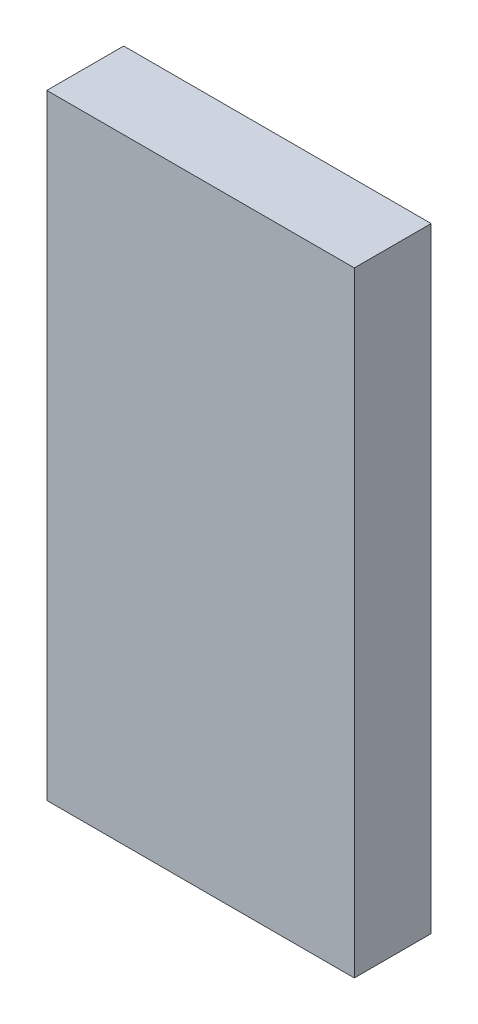
ISO-10303-21;
HEADER;
FILE_DESCRIPTION(('STEP AP214'),'2;1');
FILE_NAME('part.step','',(''),(''),'','','');
FILE_SCHEMA(('AUTOMOTIVE_DESIGN { 1 0 10303 214 1 1 1 1 }'));
ENDSEC;
DATA;
#1=APPLICATION_CONTEXT('core data for automotive mechanical design processes');
#2=APPLICATION_PROTOCOL_DEFINITION('international standard','automotive_design',2000,#1);
#3=PRODUCT_CONTEXT('',#1,'mechanical');
#4=PRODUCT('Part','Part','',(#3));
#5=PRODUCT_RELATED_PRODUCT_CATEGORY('part','',(#4));
#6=PRODUCT_DEFINITION_FORMATION('','',#4);
#7=PRODUCT_DEFINITION_CONTEXT('part definition',#1,'design');
#8=PRODUCT_DEFINITION('design','',#6,#7);
#9=PRODUCT_DEFINITION_SHAPE('','',#8);
#10=(LENGTH_UNIT() NAMED_UNIT(*) SI_UNIT(.MILLI.,.METRE.));
#11=(NAMED_UNIT(*) PLANE_ANGLE_UNIT() SI_UNIT($,.RADIAN.));
#12=(NAMED_UNIT(*) SI_UNIT($,.STERADIAN.) SOLID_ANGLE_UNIT());
#13=UNCERTAINTY_MEASURE_WITH_UNIT(LENGTH_MEASURE(1.E-05),#10,'distance_accuracy_value','');
#14=(GEOMETRIC_REPRESENTATION_CONTEXT(3) GLOBAL_UNCERTAINTY_ASSIGNED_CONTEXT((#13)) GLOBAL_UNIT_ASSIGNED_CONTEXT((#10,
#11,#12)) REPRESENTATION_CONTEXT('',''));
#15=CARTESIAN_POINT('',(0.,0.,0.));
#16=DIRECTION('',(0.,0.,1.));
#17=DIRECTION('',(1.,0.,0.));
#18=AXIS2_PLACEMENT_3D('',#15,#16,#17);
#19=CARTESIAN_POINT('',(-12.7,25.4,3.175));
#20=DIRECTION('',(1.,0.,0.));
#21=DIRECTION('',(0.,1.,0.));
#22=AXIS2_PLACEMENT_3D('',#19,#20,#21);
#23=PLANE('',#22);
#24=DIRECTION('',(0.,-1.,0.));
#25=VECTOR('',#24,1.);
#26=CARTESIAN_POINT('',(-12.7,25.4,-3.175));
#27=LINE('',#26,#25);
#28=CARTESIAN_POINT('',(-12.7,25.4,-3.175));
#29=VERTEX_POINT('',#28);
#30=CARTESIAN_POINT('',(-12.7,-25.4,-3.175));
#31=VERTEX_POINT('',#30);
#32=EDGE_CURVE('E106',#29,#31,#27,.T.);
#33=ORIENTED_EDGE('',*,*,#32,.T.);
#34=DIRECTION('',(0.,0.,-1.));
#35=VECTOR('',#34,1.);
#36=CARTESIAN_POINT('',(-12.7,-25.4,3.175));
#37=LINE('',#36,#35);
#38=CARTESIAN_POINT('',(-12.7,-25.4,3.175));
#39=VERTEX_POINT('',#38);
#40=EDGE_CURVE('E11',#39,#31,#37,.T.);
#41=ORIENTED_EDGE('',*,*,#40,.F.);
#42=DIRECTION('',(0.,-1.,0.));
#43=VECTOR('',#42,1.);
#44=CARTESIAN_POINT('',(-12.7,25.4,3.175));
#45=LINE('',#44,#43);
#46=CARTESIAN_POINT('',(-12.7,25.4,3.175));
#47=VERTEX_POINT('',#46);
#48=EDGE_CURVE('E88',#47,#39,#45,.T.);
#49=ORIENTED_EDGE('',*,*,#48,.F.);
#50=DIRECTION('',(0.,0.,-1.));
#51=VECTOR('',#50,1.);
#52=CARTESIAN_POINT('',(-12.7,25.4,3.175));
#53=LINE('',#52,#51);
#54=EDGE_CURVE('E102',#47,#29,#53,.T.);
#55=ORIENTED_EDGE('',*,*,#54,.T.);
#56=EDGE_LOOP('',(#33,#41,#49,#55));
#57=FACE_BOUND('',#56,.T.);
#58=ADVANCED_FACE('F36',(#57),#23,.F.);
#59=CARTESIAN_POINT('',(-12.7,-25.4,3.175));
#60=DIRECTION('',(0.,1.,0.));
#61=DIRECTION('',(0.,0.,1.));
#62=AXIS2_PLACEMENT_3D('',#59,#60,#61);
#63=PLANE('',#62);
#64=DIRECTION('',(1.,0.,0.));
#65=VECTOR('',#64,1.);
#66=CARTESIAN_POINT('',(-12.7,-25.4,-3.175));
#67=LINE('',#66,#65);
#68=CARTESIAN_POINT('',(12.7,-25.4,-3.175));
#69=VERTEX_POINT('',#68);
#70=EDGE_CURVE('E93',#31,#69,#67,.T.);
#71=ORIENTED_EDGE('',*,*,#70,.T.);
#72=DIRECTION('',(0.,0.,-1.));
#73=VECTOR('',#72,1.);
#74=CARTESIAN_POINT('',(12.7,-25.4,3.175));
#75=LINE('',#74,#73);
#76=CARTESIAN_POINT('',(12.7,-25.4,3.175));
#77=VERTEX_POINT('',#76);
#78=EDGE_CURVE('E45',#77,#69,#75,.T.);
#79=ORIENTED_EDGE('',*,*,#78,.F.);
#80=DIRECTION('',(1.,0.,0.));
#81=VECTOR('',#80,1.);
#82=CARTESIAN_POINT('',(-12.7,-25.4,3.175));
#83=LINE('',#82,#81);
#84=EDGE_CURVE('E83',#39,#77,#83,.T.);
#85=ORIENTED_EDGE('',*,*,#84,.F.);
#86=ORIENTED_EDGE('',*,*,#40,.T.);
#87=EDGE_LOOP('',(#71,#79,#85,#86));
#88=FACE_BOUND('',#87,.T.);
#89=ADVANCED_FACE('F92',(#88),#63,.F.);
#90=CARTESIAN_POINT('',(12.7,25.4,3.175));
#91=DIRECTION('',(-1.,0.,0.));
#92=DIRECTION('',(0.,-1.,0.));
#93=AXIS2_PLACEMENT_3D('',#90,#91,#92);
#94=PLANE('',#93);
#95=DIRECTION('',(0.,1.,0.));
#96=VECTOR('',#95,1.);
#97=CARTESIAN_POINT('',(12.7,25.4,-3.175));
#98=LINE('',#97,#96);
#99=CARTESIAN_POINT('',(12.7,25.4,-3.175));
#100=VERTEX_POINT('',#99);
#101=EDGE_CURVE('E70',#69,#100,#98,.T.);
#102=ORIENTED_EDGE('',*,*,#101,.T.);
#103=DIRECTION('',(0.,0.,-1.));
#104=VECTOR('',#103,1.);
#105=CARTESIAN_POINT('',(12.7,25.4,3.175));
#106=LINE('',#105,#104);
#107=CARTESIAN_POINT('',(12.7,25.4,3.175));
#108=VERTEX_POINT('',#107);
#109=EDGE_CURVE('E95',#108,#100,#106,.T.);
#110=ORIENTED_EDGE('',*,*,#109,.F.);
#111=DIRECTION('',(0.,1.,0.));
#112=VECTOR('',#111,1.);
#113=CARTESIAN_POINT('',(12.7,25.4,3.175));
#114=LINE('',#113,#112);
#115=EDGE_CURVE('E86',#77,#108,#114,.T.);
#116=ORIENTED_EDGE('',*,*,#115,.F.);
#117=ORIENTED_EDGE('',*,*,#78,.T.);
#118=EDGE_LOOP('',(#102,#110,#116,#117));
#119=FACE_BOUND('',#118,.T.);
#120=ADVANCED_FACE('F96',(#119),#94,.F.);
#121=CARTESIAN_POINT('',(-12.7,25.4,3.175));
#122=DIRECTION('',(0.,-1.,0.));
#123=DIRECTION('',(0.,0.,-1.));
#124=AXIS2_PLACEMENT_3D('',#121,#122,#123);
#125=PLANE('',#124);
#126=DIRECTION('',(-1.,0.,0.));
#127=VECTOR('',#126,1.);
#128=CARTESIAN_POINT('',(-12.7,25.4,-3.175));
#129=LINE('',#128,#127);
#130=EDGE_CURVE('E76',#100,#29,#129,.T.);
#131=ORIENTED_EDGE('',*,*,#130,.T.);
#132=ORIENTED_EDGE('',*,*,#54,.F.);
#133=DIRECTION('',(-1.,0.,0.));
#134=VECTOR('',#133,1.);
#135=CARTESIAN_POINT('',(-12.7,25.4,3.175));
#136=LINE('',#135,#134);
#137=EDGE_CURVE('E53',#108,#47,#136,.T.);
#138=ORIENTED_EDGE('',*,*,#137,.F.);
#139=ORIENTED_EDGE('',*,*,#109,.T.);
#140=EDGE_LOOP('',(#131,#132,#138,#139));
#141=FACE_BOUND('',#140,.T.);
#142=ADVANCED_FACE('F117',(#141),#125,.F.);
#143=CARTESIAN_POINT('',(0.,0.,3.175));
#144=DIRECTION('',(0.,0.,1.));
#145=DIRECTION('',(1.,0.,0.));
#146=AXIS2_PLACEMENT_3D('',#143,#144,#145);
#147=PLANE('',#146);
#148=ORIENTED_EDGE('',*,*,#48,.T.);
#149=ORIENTED_EDGE('',*,*,#84,.T.);
#150=ORIENTED_EDGE('',*,*,#115,.T.);
#151=ORIENTED_EDGE('',*,*,#137,.T.);
#152=EDGE_LOOP('',(#148,#149,#150,#151));
#153=FACE_BOUND('',#152,.T.);
#154=ADVANCED_FACE('F84',(#153),#147,.T.);
#155=CARTESIAN_POINT('',(0.,0.,-3.175));
#156=DIRECTION('',(0.,0.,1.));
#157=DIRECTION('',(1.,0.,0.));
#158=AXIS2_PLACEMENT_3D('',#155,#156,#157);
#159=PLANE('',#158);
#160=ORIENTED_EDGE('',*,*,#32,.F.);
#161=ORIENTED_EDGE('',*,*,#130,.F.);
#162=ORIENTED_EDGE('',*,*,#101,.F.);
#163=ORIENTED_EDGE('',*,*,#70,.F.);
#164=EDGE_LOOP('',(#160,#161,#162,#163));
#165=FACE_BOUND('',#164,.T.);
#166=ADVANCED_FACE('F120',(#165),#159,.F.);
#167=CLOSED_SHELL('',(#58,#89,#120,#142,#154,#166));
#168=MANIFOLD_SOLID_BREP('B2',#167);
#169=ADVANCED_BREP_SHAPE_REPRESENTATION('',(#18,#168),#14);
#170=SHAPE_DEFINITION_REPRESENTATION(#9,#169);
ENDSEC;
END-ISO-10303-21;
